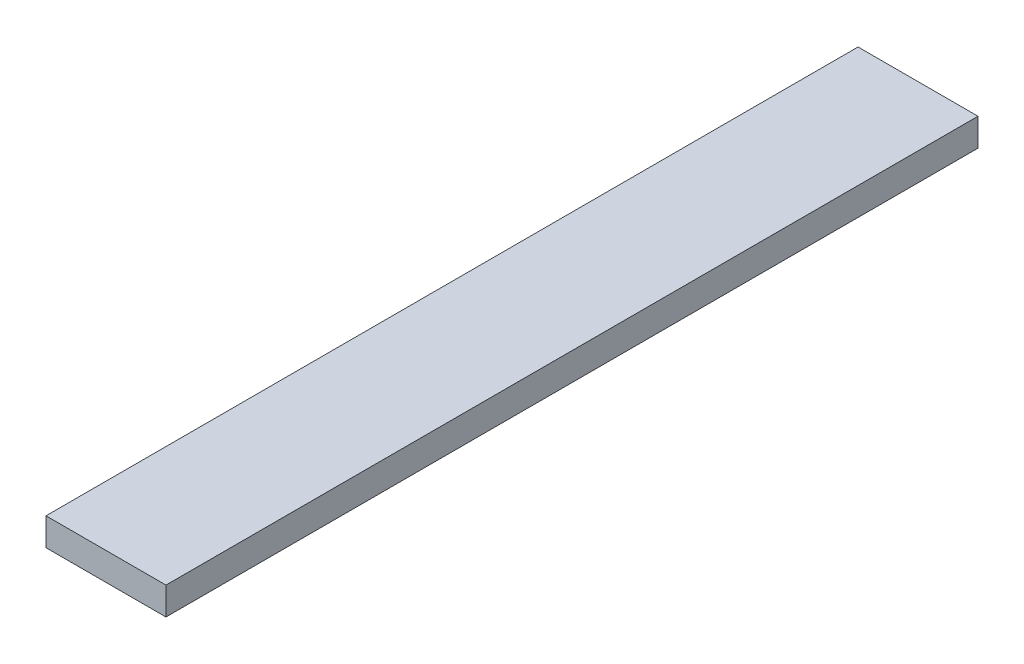
ISO-10303-21;
HEADER;
FILE_DESCRIPTION(('STEP AP214'),'2;1');
FILE_NAME('part.step','',(''),(''),'','','');
FILE_SCHEMA(('AUTOMOTIVE_DESIGN { 1 0 10303 214 1 1 1 1 }'));
ENDSEC;
DATA;
#1=APPLICATION_CONTEXT('core data for automotive mechanical design processes');
#2=APPLICATION_PROTOCOL_DEFINITION('international standard','automotive_design',2000,#1);
#3=PRODUCT_CONTEXT('',#1,'mechanical');
#4=PRODUCT('Part','Part','',(#3));
#5=PRODUCT_RELATED_PRODUCT_CATEGORY('part','',(#4));
#6=PRODUCT_DEFINITION_FORMATION('','',#4);
#7=PRODUCT_DEFINITION_CONTEXT('part definition',#1,'design');
#8=PRODUCT_DEFINITION('design','',#6,#7);
#9=PRODUCT_DEFINITION_SHAPE('','',#8);
#10=(LENGTH_UNIT() NAMED_UNIT(*) SI_UNIT(.MILLI.,.METRE.));
#11=(NAMED_UNIT(*) PLANE_ANGLE_UNIT() SI_UNIT($,.RADIAN.));
#12=(NAMED_UNIT(*) SI_UNIT($,.STERADIAN.) SOLID_ANGLE_UNIT());
#13=UNCERTAINTY_MEASURE_WITH_UNIT(LENGTH_MEASURE(1.E-05),#10,'distance_accuracy_value','');
#14=(GEOMETRIC_REPRESENTATION_CONTEXT(3) GLOBAL_UNCERTAINTY_ASSIGNED_CONTEXT((#13)) GLOBAL_UNIT_ASSIGNED_CONTEXT((#10,
#11,#12)) REPRESENTATION_CONTEXT('',''));
#15=CARTESIAN_POINT('',(0.,0.,0.));
#16=DIRECTION('',(0.,0.,1.));
#17=DIRECTION('',(1.,0.,0.));
#18=AXIS2_PLACEMENT_3D('',#15,#16,#17);
#19=CARTESIAN_POINT('',(0.,0.,279.4));
#20=DIRECTION('',(1.,0.,0.));
#21=DIRECTION('',(0.,0.,-1.));
#22=AXIS2_PLACEMENT_3D('',#19,#20,#21);
#23=PLANE('',#22);
#24=DIRECTION('',(0.,-1.,0.));
#25=VECTOR('',#24,1.);
#26=CARTESIAN_POINT('',(0.,0.,0.));
#27=LINE('',#26,#25);
#28=CARTESIAN_POINT('',(0.,9.525,0.));
#29=VERTEX_POINT('',#28);
#30=CARTESIAN_POINT('',(0.,0.,0.));
#31=VERTEX_POINT('',#30);
#32=EDGE_CURVE('E96',#29,#31,#27,.T.);
#33=ORIENTED_EDGE('',*,*,#32,.T.);
#34=DIRECTION('',(0.,0.,-1.));
#35=VECTOR('',#34,1.);
#36=CARTESIAN_POINT('',(0.,0.,279.4));
#37=LINE('',#36,#35);
#38=CARTESIAN_POINT('',(0.,0.,279.4));
#39=VERTEX_POINT('',#38);
#40=EDGE_CURVE('E11',#39,#31,#37,.T.);
#41=ORIENTED_EDGE('',*,*,#40,.F.);
#42=DIRECTION('',(0.,-1.,0.));
#43=VECTOR('',#42,1.);
#44=CARTESIAN_POINT('',(0.,0.,279.4));
#45=LINE('',#44,#43);
#46=CARTESIAN_POINT('',(0.,9.525,279.4));
#47=VERTEX_POINT('',#46);
#48=EDGE_CURVE('E84',#47,#39,#45,.T.);
#49=ORIENTED_EDGE('',*,*,#48,.F.);
#50=DIRECTION('',(0.,0.,-1.));
#51=VECTOR('',#50,1.);
#52=CARTESIAN_POINT('',(0.,9.525,279.4));
#53=LINE('',#52,#51);
#54=EDGE_CURVE('E92',#47,#29,#53,.T.);
#55=ORIENTED_EDGE('',*,*,#54,.T.);
#56=EDGE_LOOP('',(#33,#41,#49,#55));
#57=FACE_BOUND('',#56,.T.);
#58=ADVANCED_FACE('F33',(#57),#23,.F.);
#59=CARTESIAN_POINT('',(0.,0.,279.4));
#60=DIRECTION('',(0.,1.,0.));
#61=DIRECTION('',(0.,0.,1.));
#62=AXIS2_PLACEMENT_3D('',#59,#60,#61);
#63=PLANE('',#62);
#64=DIRECTION('',(1.,0.,0.));
#65=VECTOR('',#64,1.);
#66=CARTESIAN_POINT('',(0.,0.,0.));
#67=LINE('',#66,#65);
#68=CARTESIAN_POINT('',(41.275,0.,0.));
#69=VERTEX_POINT('',#68);
#70=EDGE_CURVE('E88',#31,#69,#67,.T.);
#71=ORIENTED_EDGE('',*,*,#70,.T.);
#72=DIRECTION('',(0.,0.,-1.));
#73=VECTOR('',#72,1.);
#74=CARTESIAN_POINT('',(41.275,0.,279.4));
#75=LINE('',#74,#73);
#76=CARTESIAN_POINT('',(41.275,0.,279.4));
#77=VERTEX_POINT('',#76);
#78=EDGE_CURVE('E41',#77,#69,#75,.T.);
#79=ORIENTED_EDGE('',*,*,#78,.F.);
#80=DIRECTION('',(1.,0.,0.));
#81=VECTOR('',#80,1.);
#82=CARTESIAN_POINT('',(0.,0.,279.4));
#83=LINE('',#82,#81);
#84=EDGE_CURVE('E79',#39,#77,#83,.T.);
#85=ORIENTED_EDGE('',*,*,#84,.F.);
#86=ORIENTED_EDGE('',*,*,#40,.T.);
#87=EDGE_LOOP('',(#71,#79,#85,#86));
#88=FACE_BOUND('',#87,.T.);
#89=ADVANCED_FACE('F87',(#88),#63,.F.);
#90=CARTESIAN_POINT('',(41.275,0.,279.4));
#91=DIRECTION('',(-1.,0.,0.));
#92=DIRECTION('',(0.,0.,1.));
#93=AXIS2_PLACEMENT_3D('',#90,#91,#92);
#94=PLANE('',#93);
#95=DIRECTION('',(0.,1.,0.));
#96=VECTOR('',#95,1.);
#97=CARTESIAN_POINT('',(41.275,0.,0.));
#98=LINE('',#97,#96);
#99=CARTESIAN_POINT('',(41.275,9.525,0.));
#100=VERTEX_POINT('',#99);
#101=EDGE_CURVE('E66',#69,#100,#98,.T.);
#102=ORIENTED_EDGE('',*,*,#101,.T.);
#103=DIRECTION('',(0.,0.,-1.));
#104=VECTOR('',#103,1.);
#105=CARTESIAN_POINT('',(41.275,9.525,279.4));
#106=LINE('',#105,#104);
#107=CARTESIAN_POINT('',(41.275,9.525,279.4));
#108=VERTEX_POINT('',#107);
#109=EDGE_CURVE('E89',#108,#100,#106,.T.);
#110=ORIENTED_EDGE('',*,*,#109,.F.);
#111=DIRECTION('',(0.,1.,0.));
#112=VECTOR('',#111,1.);
#113=CARTESIAN_POINT('',(41.275,0.,279.4));
#114=LINE('',#113,#112);
#115=EDGE_CURVE('E82',#77,#108,#114,.T.);
#116=ORIENTED_EDGE('',*,*,#115,.F.);
#117=ORIENTED_EDGE('',*,*,#78,.T.);
#118=EDGE_LOOP('',(#102,#110,#116,#117));
#119=FACE_BOUND('',#118,.T.);
#120=ADVANCED_FACE('F90',(#119),#94,.F.);
#121=CARTESIAN_POINT('',(0.,9.525,279.4));
#122=DIRECTION('',(0.,-1.,0.));
#123=DIRECTION('',(0.,0.,-1.));
#124=AXIS2_PLACEMENT_3D('',#121,#122,#123);
#125=PLANE('',#124);
#126=DIRECTION('',(-1.,0.,0.));
#127=VECTOR('',#126,1.);
#128=CARTESIAN_POINT('',(0.,9.525,0.));
#129=LINE('',#128,#127);
#130=EDGE_CURVE('E72',#100,#29,#129,.T.);
#131=ORIENTED_EDGE('',*,*,#130,.T.);
#132=ORIENTED_EDGE('',*,*,#54,.F.);
#133=DIRECTION('',(-1.,0.,0.));
#134=VECTOR('',#133,1.);
#135=CARTESIAN_POINT('',(0.,9.525,279.4));
#136=LINE('',#135,#134);
#137=EDGE_CURVE('E49',#108,#47,#136,.T.);
#138=ORIENTED_EDGE('',*,*,#137,.F.);
#139=ORIENTED_EDGE('',*,*,#109,.T.);
#140=EDGE_LOOP('',(#131,#132,#138,#139));
#141=FACE_BOUND('',#140,.T.);
#142=ADVANCED_FACE('F103',(#141),#125,.F.);
#143=CARTESIAN_POINT('',(0.,0.,279.4));
#144=DIRECTION('',(0.,0.,-1.));
#145=DIRECTION('',(-1.,0.,0.));
#146=AXIS2_PLACEMENT_3D('',#143,#144,#145);
#147=PLANE('',#146);
#148=ORIENTED_EDGE('',*,*,#48,.T.);
#149=ORIENTED_EDGE('',*,*,#84,.T.);
#150=ORIENTED_EDGE('',*,*,#115,.T.);
#151=ORIENTED_EDGE('',*,*,#137,.T.);
#152=EDGE_LOOP('',(#148,#149,#150,#151));
#153=FACE_BOUND('',#152,.T.);
#154=ADVANCED_FACE('F80',(#153),#147,.F.);
#155=CARTESIAN_POINT('',(0.,0.,0.));
#156=DIRECTION('',(0.,0.,-1.));
#157=DIRECTION('',(-1.,0.,0.));
#158=AXIS2_PLACEMENT_3D('',#155,#156,#157);
#159=PLANE('',#158);
#160=ORIENTED_EDGE('',*,*,#32,.F.);
#161=ORIENTED_EDGE('',*,*,#130,.F.);
#162=ORIENTED_EDGE('',*,*,#101,.F.);
#163=ORIENTED_EDGE('',*,*,#70,.F.);
#164=EDGE_LOOP('',(#160,#161,#162,#163));
#165=FACE_BOUND('',#164,.T.);
#166=ADVANCED_FACE('F106',(#165),#159,.T.);
#167=CLOSED_SHELL('',(#58,#89,#120,#142,#154,#166));
#168=MANIFOLD_SOLID_BREP('B2',#167);
#169=ADVANCED_BREP_SHAPE_REPRESENTATION('',(#18,#168),#14);
#170=SHAPE_DEFINITION_REPRESENTATION(#9,#169);
ENDSEC;
END-ISO-10303-21;
